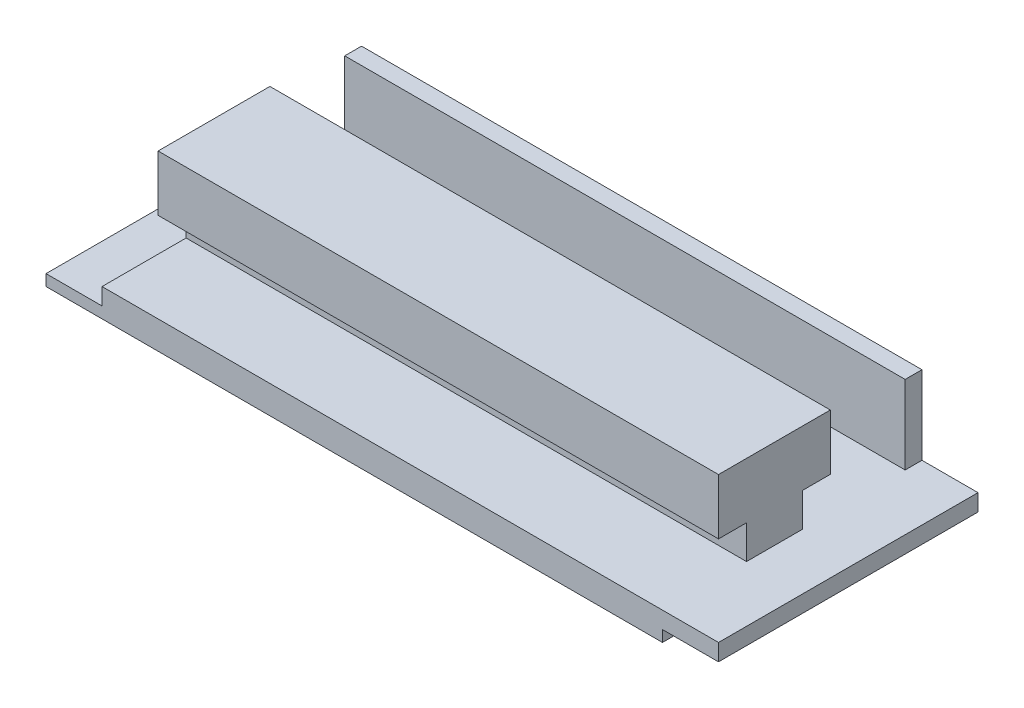
ISO-10303-21;
HEADER;
FILE_DESCRIPTION(('STEP AP214'),'2;1');
FILE_NAME('part.step','',(''),(''),'','','');
FILE_SCHEMA(('AUTOMOTIVE_DESIGN { 1 0 10303 214 1 1 1 1 }'));
ENDSEC;
DATA;
#1=APPLICATION_CONTEXT('core data for automotive mechanical design processes');
#2=APPLICATION_PROTOCOL_DEFINITION('international standard','automotive_design',2000,#1);
#3=PRODUCT_CONTEXT('',#1,'mechanical');
#4=PRODUCT('Part','Part','',(#3));
#5=PRODUCT_RELATED_PRODUCT_CATEGORY('part','',(#4));
#6=PRODUCT_DEFINITION_FORMATION('','',#4);
#7=PRODUCT_DEFINITION_CONTEXT('part definition',#1,'design');
#8=PRODUCT_DEFINITION('design','',#6,#7);
#9=PRODUCT_DEFINITION_SHAPE('','',#8);
#10=(LENGTH_UNIT() NAMED_UNIT(*) SI_UNIT(.MILLI.,.METRE.));
#11=(NAMED_UNIT(*) PLANE_ANGLE_UNIT() SI_UNIT($,.RADIAN.));
#12=(NAMED_UNIT(*) SI_UNIT($,.STERADIAN.) SOLID_ANGLE_UNIT());
#13=UNCERTAINTY_MEASURE_WITH_UNIT(LENGTH_MEASURE(1.E-05),#10,'distance_accuracy_value','');
#14=(GEOMETRIC_REPRESENTATION_CONTEXT(3) GLOBAL_UNCERTAINTY_ASSIGNED_CONTEXT((#13)) GLOBAL_UNIT_ASSIGNED_CONTEXT((#10,
#11,#12)) REPRESENTATION_CONTEXT('',''));
#15=CARTESIAN_POINT('',(0.,0.,0.));
#16=DIRECTION('',(0.,0.,1.));
#17=DIRECTION('',(1.,0.,0.));
#18=AXIS2_PLACEMENT_3D('',#15,#16,#17);
#19=CARTESIAN_POINT('',(100.,0.,0.));
#20=DIRECTION('',(1.,0.,0.));
#21=DIRECTION('',(0.,0.,-1.));
#22=AXIS2_PLACEMENT_3D('',#19,#20,#21);
#23=PLANE('',#22);
#24=DIRECTION('',(0.,-1.,0.));
#25=VECTOR('',#24,1.);
#26=CARTESIAN_POINT('',(100.,0.,10.538894187501));
#27=LINE('',#26,#25);
#28=CARTESIAN_POINT('',(100.,11.9412840372891,10.538894187501));
#29=VERTEX_POINT('',#28);
#30=CARTESIAN_POINT('',(100.,5.94140840995716,10.538894187501));
#31=VERTEX_POINT('',#30);
#32=EDGE_CURVE('E274',#29,#31,#27,.T.);
#33=ORIENTED_EDGE('',*,*,#32,.T.);
#34=DIRECTION('',(0.,0.,-1.));
#35=VECTOR('',#34,1.);
#36=CARTESIAN_POINT('',(100.,5.94140840995716,0.));
#37=LINE('',#36,#35);
#38=CARTESIAN_POINT('',(100.,5.94140840995716,0.588894187500952));
#39=VERTEX_POINT('',#38);
#40=EDGE_CURVE('E11',#31,#39,#37,.T.);
#41=ORIENTED_EDGE('',*,*,#40,.T.);
#42=DIRECTION('',(0.,1.,0.));
#43=VECTOR('',#42,1.);
#44=CARTESIAN_POINT('',(100.,0.,0.588894187500949));
#45=LINE('',#44,#43);
#46=CARTESIAN_POINT('',(100.,11.9414084099572,0.588894187500954));
#47=VERTEX_POINT('',#46);
#48=EDGE_CURVE('E255',#39,#47,#45,.T.);
#49=ORIENTED_EDGE('',*,*,#48,.T.);
#50=DIRECTION('',(0.,0.,-1.));
#51=VECTOR('',#50,1.);
#52=CARTESIAN_POINT('',(100.,11.9414084099572,0.));
#53=LINE('',#52,#51);
#54=CARTESIAN_POINT('',(100.,11.9414084099572,-4.41110581249905));
#55=VERTEX_POINT('',#54);
#56=EDGE_CURVE('E258',#47,#55,#53,.T.);
#57=ORIENTED_EDGE('',*,*,#56,.T.);
#58=DIRECTION('',(0.,1.,0.));
#59=VECTOR('',#58,1.);
#60=CARTESIAN_POINT('',(100.,0.,-4.41110581249905));
#61=LINE('',#60,#59);
#62=CARTESIAN_POINT('',(100.,21.8912840372891,-4.41110581249904));
#63=VERTEX_POINT('',#62);
#64=EDGE_CURVE('E261',#55,#63,#61,.T.);
#65=ORIENTED_EDGE('',*,*,#64,.T.);
#66=DIRECTION('',(0.,0.,-1.));
#67=VECTOR('',#66,1.);
#68=CARTESIAN_POINT('',(100.,21.8912840372891,0.));
#69=LINE('',#68,#67);
#70=CARTESIAN_POINT('',(100.,21.8912840372891,15.538894187501));
#71=VERTEX_POINT('',#70);
#72=EDGE_CURVE('E264',#71,#63,#69,.T.);
#73=ORIENTED_EDGE('',*,*,#72,.F.);
#74=DIRECTION('',(0.,-1.,0.));
#75=VECTOR('',#74,1.);
#76=CARTESIAN_POINT('',(100.,0.,15.538894187501));
#77=LINE('',#76,#75);
#78=CARTESIAN_POINT('',(100.,11.9412840372891,15.538894187501));
#79=VERTEX_POINT('',#78);
#80=EDGE_CURVE('E268',#71,#79,#77,.T.);
#81=ORIENTED_EDGE('',*,*,#80,.T.);
#82=DIRECTION('',(0.,0.,-1.));
#83=VECTOR('',#82,1.);
#84=CARTESIAN_POINT('',(100.,11.9412840372891,0.));
#85=LINE('',#84,#83);
#86=EDGE_CURVE('E271',#79,#29,#85,.T.);
#87=ORIENTED_EDGE('',*,*,#86,.T.);
#88=EDGE_LOOP('',(#33,#41,#49,#57,#65,#73,#81,#87));
#89=FACE_BOUND('',#88,.T.);
#90=ADVANCED_FACE('F41',(#89),#23,.T.);
#91=DIRECTION('',(0.,-1.,0.));
#92=VECTOR('',#91,1.);
#93=CARTESIAN_POINT('',(100.,0.,-17.7634100830838));
#94=LINE('',#93,#92);
#95=CARTESIAN_POINT('',(100.,19.9414084099572,-17.7634100830838));
#96=VERTEX_POINT('',#95);
#97=CARTESIAN_POINT('',(100.,5.94140840995716,-17.7634100830838));
#98=VERTEX_POINT('',#97);
#99=EDGE_CURVE('E251',#96,#98,#94,.T.);
#100=ORIENTED_EDGE('',*,*,#99,.T.);
#101=CARTESIAN_POINT('',(100.,5.94140840995716,-20.7634100830838));
#102=VERTEX_POINT('',#101);
#103=EDGE_CURVE('E51',#98,#102,#37,.T.);
#104=ORIENTED_EDGE('',*,*,#103,.T.);
#105=DIRECTION('',(0.,1.,0.));
#106=VECTOR('',#105,1.);
#107=CARTESIAN_POINT('',(100.,0.,-20.7634100830838));
#108=LINE('',#107,#106);
#109=CARTESIAN_POINT('',(100.,19.9414084099572,-20.7634100830838));
#110=VERTEX_POINT('',#109);
#111=EDGE_CURVE('E283',#102,#110,#108,.T.);
#112=ORIENTED_EDGE('',*,*,#111,.T.);
#113=DIRECTION('',(0.,0.,1.));
#114=VECTOR('',#113,1.);
#115=CARTESIAN_POINT('',(100.,19.9414084099572,0.));
#116=LINE('',#115,#114);
#117=EDGE_CURVE('E247',#110,#96,#116,.T.);
#118=ORIENTED_EDGE('',*,*,#117,.T.);
#119=EDGE_LOOP('',(#100,#104,#112,#118));
#120=FACE_BOUND('',#119,.T.);
#121=ADVANCED_FACE('F420',(#120),#23,.T.);
#122=CARTESIAN_POINT('',(100.,19.9414084099572,0.));
#123=DIRECTION('',(0.,-1.,0.));
#124=DIRECTION('',(0.,0.,-1.));
#125=AXIS2_PLACEMENT_3D('',#122,#123,#124);
#126=PLANE('',#125);
#127=DIRECTION('',(0.,0.,1.));
#128=VECTOR('',#127,1.);
#129=CARTESIAN_POINT('',(0.,19.9414084099572,0.));
#130=LINE('',#129,#128);
#131=CARTESIAN_POINT('',(0.,19.9414084099572,-20.7634100830838));
#132=VERTEX_POINT('',#131);
#133=CARTESIAN_POINT('',(0.,19.9414084099572,-17.7634100830838));
#134=VERTEX_POINT('',#133);
#135=EDGE_CURVE('E244',#132,#134,#130,.T.);
#136=ORIENTED_EDGE('',*,*,#135,.T.);
#137=DIRECTION('',(-1.,0.,0.));
#138=VECTOR('',#137,1.);
#139=CARTESIAN_POINT('',(100.,19.9414084099572,-17.7634100830838));
#140=LINE('',#139,#138);
#141=EDGE_CURVE('E45',#96,#134,#140,.T.);
#142=ORIENTED_EDGE('',*,*,#141,.F.);
#143=ORIENTED_EDGE('',*,*,#117,.F.);
#144=DIRECTION('',(-1.,0.,0.));
#145=VECTOR('',#144,1.);
#146=CARTESIAN_POINT('',(100.,19.9414084099572,-20.7634100830838));
#147=LINE('',#146,#145);
#148=EDGE_CURVE('E287',#110,#132,#147,.T.);
#149=ORIENTED_EDGE('',*,*,#148,.T.);
#150=EDGE_LOOP('',(#136,#142,#143,#149));
#151=FACE_BOUND('',#150,.T.);
#152=ADVANCED_FACE('F43',(#151),#126,.F.);
#153=CARTESIAN_POINT('',(100.,0.,-17.7634100830838));
#154=DIRECTION('',(0.,0.,-1.));
#155=DIRECTION('',(0.,1.,0.));
#156=AXIS2_PLACEMENT_3D('',#153,#154,#155);
#157=PLANE('',#156);
#158=DIRECTION('',(0.,-1.,0.));
#159=VECTOR('',#158,1.);
#160=CARTESIAN_POINT('',(0.,0.,-17.7634100830838));
#161=LINE('',#160,#159);
#162=CARTESIAN_POINT('',(0.,5.94140840995716,-17.7634100830838));
#163=VERTEX_POINT('',#162);
#164=EDGE_CURVE('E291',#134,#163,#161,.T.);
#165=ORIENTED_EDGE('',*,*,#164,.T.);
#166=DIRECTION('',(-1.,0.,0.));
#167=VECTOR('',#166,1.);
#168=CARTESIAN_POINT('',(100.,5.94140840995716,-17.7634100830838));
#169=LINE('',#168,#167);
#170=EDGE_CURVE('E363',#98,#163,#169,.T.);
#171=ORIENTED_EDGE('',*,*,#170,.F.);
#172=ORIENTED_EDGE('',*,*,#99,.F.);
#173=ORIENTED_EDGE('',*,*,#141,.T.);
#174=EDGE_LOOP('',(#165,#171,#172,#173));
#175=FACE_BOUND('',#174,.T.);
#176=ADVANCED_FACE('F373',(#175),#157,.F.);
#177=CARTESIAN_POINT('',(100.,0.,0.588894187500949));
#178=DIRECTION('',(0.,0.,1.));
#179=DIRECTION('',(0.,-1.,0.));
#180=AXIS2_PLACEMENT_3D('',#177,#178,#179);
#181=PLANE('',#180);
#182=DIRECTION('',(0.,1.,0.));
#183=VECTOR('',#182,1.);
#184=CARTESIAN_POINT('',(0.,0.,0.588894187500949));
#185=LINE('',#184,#183);
#186=CARTESIAN_POINT('',(0.,5.94140840995716,0.588894187500952));
#187=VERTEX_POINT('',#186);
#188=CARTESIAN_POINT('',(0.,11.9414084099572,0.588894187500954));
#189=VERTEX_POINT('',#188);
#190=EDGE_CURVE('E297',#187,#189,#185,.T.);
#191=ORIENTED_EDGE('',*,*,#190,.T.);
#192=DIRECTION('',(-1.,0.,0.));
#193=VECTOR('',#192,1.);
#194=CARTESIAN_POINT('',(100.,11.9414084099572,0.588894187500954));
#195=LINE('',#194,#193);
#196=EDGE_CURVE('E356',#47,#189,#195,.T.);
#197=ORIENTED_EDGE('',*,*,#196,.F.);
#198=ORIENTED_EDGE('',*,*,#48,.F.);
#199=DIRECTION('',(-1.,0.,0.));
#200=VECTOR('',#199,1.);
#201=CARTESIAN_POINT('',(100.,5.94140840995716,0.588894187500952));
#202=LINE('',#201,#200);
#203=EDGE_CURVE('E360',#39,#187,#202,.T.);
#204=ORIENTED_EDGE('',*,*,#203,.T.);
#205=EDGE_LOOP('',(#191,#197,#198,#204));
#206=FACE_BOUND('',#205,.T.);
#207=ADVANCED_FACE('F387',(#206),#181,.F.);
#208=CARTESIAN_POINT('',(100.,11.9414084099572,0.));
#209=DIRECTION('',(0.,1.,0.));
#210=DIRECTION('',(0.,0.,1.));
#211=AXIS2_PLACEMENT_3D('',#208,#209,#210);
#212=PLANE('',#211);
#213=DIRECTION('',(0.,0.,-1.));
#214=VECTOR('',#213,1.);
#215=CARTESIAN_POINT('',(0.,11.9414084099572,0.));
#216=LINE('',#215,#214);
#217=CARTESIAN_POINT('',(0.,11.9414084099572,-4.41110581249905));
#218=VERTEX_POINT('',#217);
#219=EDGE_CURVE('E300',#189,#218,#216,.T.);
#220=ORIENTED_EDGE('',*,*,#219,.T.);
#221=DIRECTION('',(-1.,0.,0.));
#222=VECTOR('',#221,1.);
#223=CARTESIAN_POINT('',(100.,11.9414084099572,-4.41110581249905));
#224=LINE('',#223,#222);
#225=EDGE_CURVE('E352',#55,#218,#224,.T.);
#226=ORIENTED_EDGE('',*,*,#225,.F.);
#227=ORIENTED_EDGE('',*,*,#56,.F.);
#228=ORIENTED_EDGE('',*,*,#196,.T.);
#229=EDGE_LOOP('',(#220,#226,#227,#228));
#230=FACE_BOUND('',#229,.T.);
#231=ADVANCED_FACE('F462',(#230),#212,.F.);
#232=CARTESIAN_POINT('',(100.,0.,-4.41110581249905));
#233=DIRECTION('',(0.,0.,1.));
#234=DIRECTION('',(0.,-1.,0.));
#235=AXIS2_PLACEMENT_3D('',#232,#233,#234);
#236=PLANE('',#235);
#237=DIRECTION('',(0.,1.,0.));
#238=VECTOR('',#237,1.);
#239=CARTESIAN_POINT('',(0.,0.,-4.41110581249905));
#240=LINE('',#239,#238);
#241=CARTESIAN_POINT('',(0.,21.8912840372891,-4.41110581249904));
#242=VERTEX_POINT('',#241);
#243=EDGE_CURVE('E303',#218,#242,#240,.T.);
#244=ORIENTED_EDGE('',*,*,#243,.T.);
#245=DIRECTION('',(-1.,0.,0.));
#246=VECTOR('',#245,1.);
#247=CARTESIAN_POINT('',(100.,21.8912840372891,-4.41110581249904));
#248=LINE('',#247,#246);
#249=EDGE_CURVE('E349',#63,#242,#248,.T.);
#250=ORIENTED_EDGE('',*,*,#249,.F.);
#251=ORIENTED_EDGE('',*,*,#64,.F.);
#252=ORIENTED_EDGE('',*,*,#225,.T.);
#253=EDGE_LOOP('',(#244,#250,#251,#252));
#254=FACE_BOUND('',#253,.T.);
#255=ADVANCED_FACE('F458',(#254),#236,.F.);
#256=CARTESIAN_POINT('',(100.,21.8912840372891,0.));
#257=DIRECTION('',(0.,1.,0.));
#258=DIRECTION('',(0.,0.,1.));
#259=AXIS2_PLACEMENT_3D('',#256,#257,#258);
#260=PLANE('',#259);
#261=DIRECTION('',(0.,0.,-1.));
#262=VECTOR('',#261,1.);
#263=CARTESIAN_POINT('',(0.,21.8912840372891,0.));
#264=LINE('',#263,#262);
#265=CARTESIAN_POINT('',(0.,21.8912840372891,15.538894187501));
#266=VERTEX_POINT('',#265);
#267=EDGE_CURVE('E307',#266,#242,#264,.T.);
#268=ORIENTED_EDGE('',*,*,#267,.F.);
#269=DIRECTION('',(-1.,0.,0.));
#270=VECTOR('',#269,1.);
#271=CARTESIAN_POINT('',(100.,21.8912840372891,15.538894187501));
#272=LINE('',#271,#270);
#273=EDGE_CURVE('E346',#71,#266,#272,.T.);
#274=ORIENTED_EDGE('',*,*,#273,.F.);
#275=ORIENTED_EDGE('',*,*,#72,.T.);
#276=ORIENTED_EDGE('',*,*,#249,.T.);
#277=EDGE_LOOP('',(#268,#274,#275,#276));
#278=FACE_BOUND('',#277,.T.);
#279=ADVANCED_FACE('F454',(#278),#260,.T.);
#280=CARTESIAN_POINT('',(100.,0.,15.538894187501));
#281=DIRECTION('',(0.,0.,-1.));
#282=DIRECTION('',(0.,1.,0.));
#283=AXIS2_PLACEMENT_3D('',#280,#281,#282);
#284=PLANE('',#283);
#285=DIRECTION('',(0.,-1.,0.));
#286=VECTOR('',#285,1.);
#287=CARTESIAN_POINT('',(0.,0.,15.538894187501));
#288=LINE('',#287,#286);
#289=CARTESIAN_POINT('',(0.,11.9412840372891,15.538894187501));
#290=VERTEX_POINT('',#289);
#291=EDGE_CURVE('E311',#266,#290,#288,.T.);
#292=ORIENTED_EDGE('',*,*,#291,.T.);
#293=DIRECTION('',(-1.,0.,0.));
#294=VECTOR('',#293,1.);
#295=CARTESIAN_POINT('',(100.,11.9412840372891,15.538894187501));
#296=LINE('',#295,#294);
#297=EDGE_CURVE('E342',#79,#290,#296,.T.);
#298=ORIENTED_EDGE('',*,*,#297,.F.);
#299=ORIENTED_EDGE('',*,*,#80,.F.);
#300=ORIENTED_EDGE('',*,*,#273,.T.);
#301=EDGE_LOOP('',(#292,#298,#299,#300));
#302=FACE_BOUND('',#301,.T.);
#303=ADVANCED_FACE('F450',(#302),#284,.F.);
#304=CARTESIAN_POINT('',(100.,11.9412840372891,0.));
#305=DIRECTION('',(0.,1.,0.));
#306=DIRECTION('',(0.,0.,1.));
#307=AXIS2_PLACEMENT_3D('',#304,#305,#306);
#308=PLANE('',#307);
#309=DIRECTION('',(0.,0.,-1.));
#310=VECTOR('',#309,1.);
#311=CARTESIAN_POINT('',(0.,11.9412840372891,0.));
#312=LINE('',#311,#310);
#313=CARTESIAN_POINT('',(0.,11.9412840372891,10.538894187501));
#314=VERTEX_POINT('',#313);
#315=EDGE_CURVE('E314',#290,#314,#312,.T.);
#316=ORIENTED_EDGE('',*,*,#315,.T.);
#317=DIRECTION('',(-1.,0.,0.));
#318=VECTOR('',#317,1.);
#319=CARTESIAN_POINT('',(100.,11.9412840372891,10.538894187501));
#320=LINE('',#319,#318);
#321=EDGE_CURVE('E338',#29,#314,#320,.T.);
#322=ORIENTED_EDGE('',*,*,#321,.F.);
#323=ORIENTED_EDGE('',*,*,#86,.F.);
#324=ORIENTED_EDGE('',*,*,#297,.T.);
#325=EDGE_LOOP('',(#316,#322,#323,#324));
#326=FACE_BOUND('',#325,.T.);
#327=ADVANCED_FACE('F447',(#326),#308,.F.);
#328=CARTESIAN_POINT('',(100.,0.,10.538894187501));
#329=DIRECTION('',(0.,0.,-1.));
#330=DIRECTION('',(-1.,0.,0.));
#331=AXIS2_PLACEMENT_3D('',#328,#329,#330);
#332=PLANE('',#331);
#333=DIRECTION('',(0.,-1.,0.));
#334=VECTOR('',#333,1.);
#335=CARTESIAN_POINT('',(0.,0.,10.538894187501));
#336=LINE('',#335,#334);
#337=CARTESIAN_POINT('',(0.,5.94140840995716,10.538894187501));
#338=VERTEX_POINT('',#337);
#339=EDGE_CURVE('E317',#314,#338,#336,.T.);
#340=ORIENTED_EDGE('',*,*,#339,.T.);
#341=DIRECTION('',(-1.,0.,0.));
#342=VECTOR('',#341,1.);
#343=CARTESIAN_POINT('',(100.,5.94140840995716,10.538894187501));
#344=LINE('',#343,#342);
#345=EDGE_CURVE('E185',#31,#338,#344,.T.);
#346=ORIENTED_EDGE('',*,*,#345,.F.);
#347=ORIENTED_EDGE('',*,*,#32,.F.);
#348=ORIENTED_EDGE('',*,*,#321,.T.);
#349=EDGE_LOOP('',(#340,#346,#347,#348));
#350=FACE_BOUND('',#349,.T.);
#351=ADVANCED_FACE('F396',(#350),#332,.F.);
#352=CARTESIAN_POINT('',(100.,5.94140840995716,0.));
#353=DIRECTION('',(0.,1.,0.));
#354=DIRECTION('',(0.,0.,1.));
#355=AXIS2_PLACEMENT_3D('',#352,#353,#354);
#356=PLANE('',#355);
#357=DIRECTION('',(0.,0.,-1.));
#358=VECTOR('',#357,1.);
#359=CARTESIAN_POINT('',(0.,5.94140840995716,0.));
#360=LINE('',#359,#358);
#361=CARTESIAN_POINT('',(0.,5.94140840995716,25.538894187501));
#362=VERTEX_POINT('',#361);
#363=EDGE_CURVE('E180',#362,#338,#360,.T.);
#364=ORIENTED_EDGE('',*,*,#363,.F.);
#365=DIRECTION('',(-1.,0.,0.));
#366=VECTOR('',#365,1.);
#367=CARTESIAN_POINT('',(100.,5.94140840995716,25.538894187501));
#368=LINE('',#367,#366);
#369=CARTESIAN_POINT('',(110.,5.94140840995716,25.538894187501));
#370=VERTEX_POINT('',#369);
#371=EDGE_CURVE('E173',#370,#362,#368,.T.);
#372=ORIENTED_EDGE('',*,*,#371,.F.);
#373=DIRECTION('',(0.,0.,-1.));
#374=VECTOR('',#373,1.);
#375=CARTESIAN_POINT('',(110.,5.94140840995716,0.));
#376=LINE('',#375,#374);
#377=CARTESIAN_POINT('',(110.,5.94140840995716,-20.7634100830838));
#378=VERTEX_POINT('',#377);
#379=EDGE_CURVE('E178',#370,#378,#376,.T.);
#380=ORIENTED_EDGE('',*,*,#379,.T.);
#381=DIRECTION('',(-1.,0.,0.));
#382=VECTOR('',#381,1.);
#383=CARTESIAN_POINT('',(110.,5.94140840995716,-20.7634100830838));
#384=LINE('',#383,#382);
#385=EDGE_CURVE('E210',#378,#102,#384,.T.);
#386=ORIENTED_EDGE('',*,*,#385,.T.);
#387=ORIENTED_EDGE('',*,*,#103,.F.);
#388=ORIENTED_EDGE('',*,*,#170,.T.);
#389=DIRECTION('',(0.,0.,1.));
#390=VECTOR('',#389,1.);
#391=CARTESIAN_POINT('',(0.,5.94140840995716,0.));
#392=LINE('',#391,#390);
#393=EDGE_CURVE('E294',#163,#187,#392,.T.);
#394=ORIENTED_EDGE('',*,*,#393,.T.);
#395=ORIENTED_EDGE('',*,*,#203,.F.);
#396=ORIENTED_EDGE('',*,*,#40,.F.);
#397=ORIENTED_EDGE('',*,*,#345,.T.);
#398=EDGE_LOOP('',(#364,#372,#380,#386,#387,#388,#394,#395,#396,#397));
#399=FACE_BOUND('',#398,.T.);
#400=ADVANCED_FACE('F175',(#399),#356,.T.);
#401=CARTESIAN_POINT('',(100.,0.,25.538894187501));
#402=DIRECTION('',(0.,0.,-1.));
#403=DIRECTION('',(-1.,0.,0.));
#404=AXIS2_PLACEMENT_3D('',#401,#402,#403);
#405=PLANE('',#404);
#406=DIRECTION('',(0.,-1.,0.));
#407=VECTOR('',#406,1.);
#408=CARTESIAN_POINT('',(0.,0.,25.538894187501));
#409=LINE('',#408,#407);
#410=CARTESIAN_POINT('',(0.,2.94140840995716,25.538894187501));
#411=VERTEX_POINT('',#410);
#412=EDGE_CURVE('E323',#362,#411,#409,.T.);
#413=ORIENTED_EDGE('',*,*,#412,.T.);
#414=DIRECTION('',(1.,0.,0.));
#415=VECTOR('',#414,1.);
#416=CARTESIAN_POINT('',(-10.,2.94140840995716,25.538894187501));
#417=LINE('',#416,#415);
#418=CARTESIAN_POINT('',(-10.,2.94140840995716,25.538894187501));
#419=VERTEX_POINT('',#418);
#420=EDGE_CURVE('E241',#419,#411,#417,.T.);
#421=ORIENTED_EDGE('',*,*,#420,.F.);
#422=DIRECTION('',(0.,-1.,0.));
#423=VECTOR('',#422,1.);
#424=CARTESIAN_POINT('',(-10.,2.94140840995716,25.538894187501));
#425=LINE('',#424,#423);
#426=CARTESIAN_POINT('',(-10.,0.941408409957157,25.538894187501));
#427=VERTEX_POINT('',#426);
#428=EDGE_CURVE('E233',#419,#427,#425,.T.);
#429=ORIENTED_EDGE('',*,*,#428,.T.);
#430=DIRECTION('',(-1.,0.,0.));
#431=VECTOR('',#430,1.);
#432=CARTESIAN_POINT('',(100.,0.941408409957157,25.538894187501));
#433=LINE('',#432,#431);
#434=CARTESIAN_POINT('',(100.,0.941408409957157,25.538894187501));
#435=VERTEX_POINT('',#434);
#436=EDGE_CURVE('E186',#435,#427,#433,.T.);
#437=ORIENTED_EDGE('',*,*,#436,.F.);
#438=DIRECTION('',(0.,-1.,0.));
#439=VECTOR('',#438,1.);
#440=CARTESIAN_POINT('',(100.,0.,25.538894187501));
#441=LINE('',#440,#439);
#442=CARTESIAN_POINT('',(100.,2.94140840995716,25.538894187501));
#443=VERTEX_POINT('',#442);
#444=EDGE_CURVE('E277',#443,#435,#441,.T.);
#445=ORIENTED_EDGE('',*,*,#444,.F.);
#446=DIRECTION('',(-1.,0.,0.));
#447=VECTOR('',#446,1.);
#448=CARTESIAN_POINT('',(110.,2.94140840995716,25.538894187501));
#449=LINE('',#448,#447);
#450=CARTESIAN_POINT('',(110.,2.94140840995716,25.538894187501));
#451=VERTEX_POINT('',#450);
#452=EDGE_CURVE('E192',#451,#443,#449,.T.);
#453=ORIENTED_EDGE('',*,*,#452,.F.);
#454=DIRECTION('',(0.,-1.,0.));
#455=VECTOR('',#454,1.);
#456=CARTESIAN_POINT('',(110.,0.,25.538894187501));
#457=LINE('',#456,#455);
#458=EDGE_CURVE('E189',#370,#451,#457,.T.);
#459=ORIENTED_EDGE('',*,*,#458,.F.);
#460=ORIENTED_EDGE('',*,*,#371,.T.);
#461=EDGE_LOOP('',(#413,#421,#429,#437,#445,#453,#459,#460));
#462=FACE_BOUND('',#461,.T.);
#463=ADVANCED_FACE('F190',(#462),#405,.F.);
#464=CARTESIAN_POINT('',(100.,0.941408409957157,0.));
#465=DIRECTION('',(0.,1.,0.));
#466=DIRECTION('',(0.,0.,1.));
#467=AXIS2_PLACEMENT_3D('',#464,#465,#466);
#468=PLANE('',#467);
#469=ORIENTED_EDGE('',*,*,#436,.T.);
#470=DIRECTION('',(0.,0.,-1.));
#471=VECTOR('',#470,1.);
#472=CARTESIAN_POINT('',(-10.,0.941408409957157,25.538894187501));
#473=LINE('',#472,#471);
#474=CARTESIAN_POINT('',(-10.,0.941408409957157,-20.7634100830838));
#475=VERTEX_POINT('',#474);
#476=EDGE_CURVE('E221',#427,#475,#473,.T.);
#477=ORIENTED_EDGE('',*,*,#476,.T.);
#478=DIRECTION('',(-1.,0.,0.));
#479=VECTOR('',#478,1.);
#480=CARTESIAN_POINT('',(100.,0.941408409957157,-20.7634100830838));
#481=LINE('',#480,#479);
#482=CARTESIAN_POINT('',(100.,0.941408409957157,-20.7634100830838));
#483=VERTEX_POINT('',#482);
#484=EDGE_CURVE('E331',#483,#475,#481,.T.);
#485=ORIENTED_EDGE('',*,*,#484,.F.);
#486=DIRECTION('',(0.,0.,-1.));
#487=VECTOR('',#486,1.);
#488=CARTESIAN_POINT('',(100.,0.941408409957157,0.));
#489=LINE('',#488,#487);
#490=EDGE_CURVE('E280',#435,#483,#489,.T.);
#491=ORIENTED_EDGE('',*,*,#490,.F.);
#492=EDGE_LOOP('',(#469,#477,#485,#491));
#493=FACE_BOUND('',#492,.T.);
#494=ADVANCED_FACE('F411',(#493),#468,.F.);
#495=CARTESIAN_POINT('',(100.,0.,-20.7634100830838));
#496=DIRECTION('',(0.,0.,1.));
#497=DIRECTION('',(1.,0.,0.));
#498=AXIS2_PLACEMENT_3D('',#495,#496,#497);
#499=PLANE('',#498);
#500=ORIENTED_EDGE('',*,*,#484,.T.);
#501=DIRECTION('',(0.,1.,0.));
#502=VECTOR('',#501,1.);
#503=CARTESIAN_POINT('',(-10.,0.941408409957157,-20.7634100830838));
#504=LINE('',#503,#502);
#505=CARTESIAN_POINT('',(-10.,2.94140840995716,-20.7634100830838));
#506=VERTEX_POINT('',#505);
#507=EDGE_CURVE('E225',#475,#506,#504,.T.);
#508=ORIENTED_EDGE('',*,*,#507,.T.);
#509=DIRECTION('',(1.,0.,0.));
#510=VECTOR('',#509,1.);
#511=CARTESIAN_POINT('',(-10.,2.94140840995716,-20.7634100830838));
#512=LINE('',#511,#510);
#513=CARTESIAN_POINT('',(0.,2.94140840995716,-20.7634100830838));
#514=VERTEX_POINT('',#513);
#515=EDGE_CURVE('E237',#506,#514,#512,.T.);
#516=ORIENTED_EDGE('',*,*,#515,.T.);
#517=DIRECTION('',(0.,1.,0.));
#518=VECTOR('',#517,1.);
#519=CARTESIAN_POINT('',(0.,0.,-20.7634100830838));
#520=LINE('',#519,#518);
#521=EDGE_CURVE('E252',#514,#132,#520,.T.);
#522=ORIENTED_EDGE('',*,*,#521,.T.);
#523=ORIENTED_EDGE('',*,*,#148,.F.);
#524=ORIENTED_EDGE('',*,*,#111,.F.);
#525=ORIENTED_EDGE('',*,*,#385,.F.);
#526=DIRECTION('',(0.,1.,0.));
#527=VECTOR('',#526,1.);
#528=CARTESIAN_POINT('',(110.,0.,-20.7634100830838));
#529=LINE('',#528,#527);
#530=CARTESIAN_POINT('',(110.,2.94140840995716,-20.7634100830838));
#531=VERTEX_POINT('',#530);
#532=EDGE_CURVE('E200',#531,#378,#529,.T.);
#533=ORIENTED_EDGE('',*,*,#532,.F.);
#534=DIRECTION('',(-1.,0.,0.));
#535=VECTOR('',#534,1.);
#536=CARTESIAN_POINT('',(110.,2.94140840995716,-20.7634100830838));
#537=LINE('',#536,#535);
#538=CARTESIAN_POINT('',(100.,2.94140840995716,-20.7634100830838));
#539=VERTEX_POINT('',#538);
#540=EDGE_CURVE('E214',#531,#539,#537,.T.);
#541=ORIENTED_EDGE('',*,*,#540,.T.);
#542=EDGE_CURVE('E284',#483,#539,#108,.T.);
#543=ORIENTED_EDGE('',*,*,#542,.F.);
#544=EDGE_LOOP('',(#500,#508,#516,#522,#523,#524,#525,#533,#541,#543));
#545=FACE_BOUND('',#544,.T.);
#546=ADVANCED_FACE('F418',(#545),#499,.F.);
#547=DIRECTION('',(0.,0.,-1.));
#548=VECTOR('',#547,1.);
#549=CARTESIAN_POINT('',(100.,2.94140840995716,0.));
#550=LINE('',#549,#548);
#551=EDGE_CURVE('E66',#443,#539,#550,.T.);
#552=ORIENTED_EDGE('',*,*,#551,.F.);
#553=ORIENTED_EDGE('',*,*,#444,.T.);
#554=ORIENTED_EDGE('',*,*,#490,.T.);
#555=ORIENTED_EDGE('',*,*,#542,.T.);
#556=EDGE_LOOP('',(#552,#553,#554,#555));
#557=FACE_BOUND('',#556,.T.);
#558=ADVANCED_FACE('F423',(#557),#23,.T.);
#559=CARTESIAN_POINT('',(0.,0.,0.));
#560=DIRECTION('',(1.,0.,0.));
#561=DIRECTION('',(0.,0.,-1.));
#562=AXIS2_PLACEMENT_3D('',#559,#560,#561);
#563=PLANE('',#562);
#564=ORIENTED_EDGE('',*,*,#521,.F.);
#565=DIRECTION('',(0.,0.,1.));
#566=VECTOR('',#565,1.);
#567=CARTESIAN_POINT('',(0.,2.94140840995716,-20.7634100830838));
#568=LINE('',#567,#566);
#569=EDGE_CURVE('E220',#514,#411,#568,.T.);
#570=ORIENTED_EDGE('',*,*,#569,.T.);
#571=ORIENTED_EDGE('',*,*,#412,.F.);
#572=ORIENTED_EDGE('',*,*,#363,.T.);
#573=ORIENTED_EDGE('',*,*,#339,.F.);
#574=ORIENTED_EDGE('',*,*,#315,.F.);
#575=ORIENTED_EDGE('',*,*,#291,.F.);
#576=ORIENTED_EDGE('',*,*,#267,.T.);
#577=ORIENTED_EDGE('',*,*,#243,.F.);
#578=ORIENTED_EDGE('',*,*,#219,.F.);
#579=ORIENTED_EDGE('',*,*,#190,.F.);
#580=ORIENTED_EDGE('',*,*,#393,.F.);
#581=ORIENTED_EDGE('',*,*,#164,.F.);
#582=ORIENTED_EDGE('',*,*,#135,.F.);
#583=EDGE_LOOP('',(#564,#570,#571,#572,#573,#574,#575,#576,#577,#578,#579,#580,#581,#582));
#584=FACE_BOUND('',#583,.T.);
#585=ADVANCED_FACE('F380',(#584),#563,.F.);
#586=CARTESIAN_POINT('',(-10.,2.94140840995716,-20.7634100830838));
#587=DIRECTION('',(0.,1.,0.));
#588=DIRECTION('',(0.,0.,1.));
#589=AXIS2_PLACEMENT_3D('',#586,#587,#588);
#590=PLANE('',#589);
#591=ORIENTED_EDGE('',*,*,#569,.F.);
#592=ORIENTED_EDGE('',*,*,#515,.F.);
#593=DIRECTION('',(0.,0.,1.));
#594=VECTOR('',#593,1.);
#595=CARTESIAN_POINT('',(-10.,2.94140840995716,-20.7634100830838));
#596=LINE('',#595,#594);
#597=EDGE_CURVE('E229',#506,#419,#596,.T.);
#598=ORIENTED_EDGE('',*,*,#597,.T.);
#599=ORIENTED_EDGE('',*,*,#420,.T.);
#600=EDGE_LOOP('',(#591,#592,#598,#599));
#601=FACE_BOUND('',#600,.T.);
#602=ADVANCED_FACE('F404',(#601),#590,.T.);
#603=CARTESIAN_POINT('',(-10.,0.,0.));
#604=DIRECTION('',(1.,0.,0.));
#605=DIRECTION('',(0.,0.,-1.));
#606=AXIS2_PLACEMENT_3D('',#603,#604,#605);
#607=PLANE('',#606);
#608=ORIENTED_EDGE('',*,*,#476,.F.);
#609=ORIENTED_EDGE('',*,*,#428,.F.);
#610=ORIENTED_EDGE('',*,*,#597,.F.);
#611=ORIENTED_EDGE('',*,*,#507,.F.);
#612=EDGE_LOOP('',(#608,#609,#610,#611));
#613=FACE_BOUND('',#612,.T.);
#614=ADVANCED_FACE('F408',(#613),#607,.F.);
#615=CARTESIAN_POINT('',(110.,2.94140840995716,0.));
#616=DIRECTION('',(0.,1.,0.));
#617=DIRECTION('',(0.,0.,1.));
#618=AXIS2_PLACEMENT_3D('',#615,#616,#617);
#619=PLANE('',#618);
#620=ORIENTED_EDGE('',*,*,#551,.T.);
#621=ORIENTED_EDGE('',*,*,#540,.F.);
#622=DIRECTION('',(0.,0.,-1.));
#623=VECTOR('',#622,1.);
#624=CARTESIAN_POINT('',(110.,2.94140840995716,0.));
#625=LINE('',#624,#623);
#626=EDGE_CURVE('E196',#451,#531,#625,.T.);
#627=ORIENTED_EDGE('',*,*,#626,.F.);
#628=ORIENTED_EDGE('',*,*,#452,.T.);
#629=EDGE_LOOP('',(#620,#621,#627,#628));
#630=FACE_BOUND('',#629,.T.);
#631=ADVANCED_FACE('F415',(#630),#619,.F.);
#632=CARTESIAN_POINT('',(110.,0.,0.));
#633=DIRECTION('',(1.,0.,0.));
#634=DIRECTION('',(0.,0.,-1.));
#635=AXIS2_PLACEMENT_3D('',#632,#633,#634);
#636=PLANE('',#635);
#637=ORIENTED_EDGE('',*,*,#379,.F.);
#638=ORIENTED_EDGE('',*,*,#458,.T.);
#639=ORIENTED_EDGE('',*,*,#626,.T.);
#640=ORIENTED_EDGE('',*,*,#532,.T.);
#641=EDGE_LOOP('',(#637,#638,#639,#640));
#642=FACE_BOUND('',#641,.T.);
#643=ADVANCED_FACE('F198',(#642),#636,.T.);
#644=CLOSED_SHELL('',(#90,#121,#152,#176,#207,#231,#255,#279,#303,#327,#351,#400,#463,#494,#546,
#558,#585,#602,#614,#631,#643));
#645=MANIFOLD_SOLID_BREP('B2',#644);
#646=ADVANCED_BREP_SHAPE_REPRESENTATION('',(#18,#645),#14);
#647=SHAPE_DEFINITION_REPRESENTATION(#9,#646);
ENDSEC;
END-ISO-10303-21;
